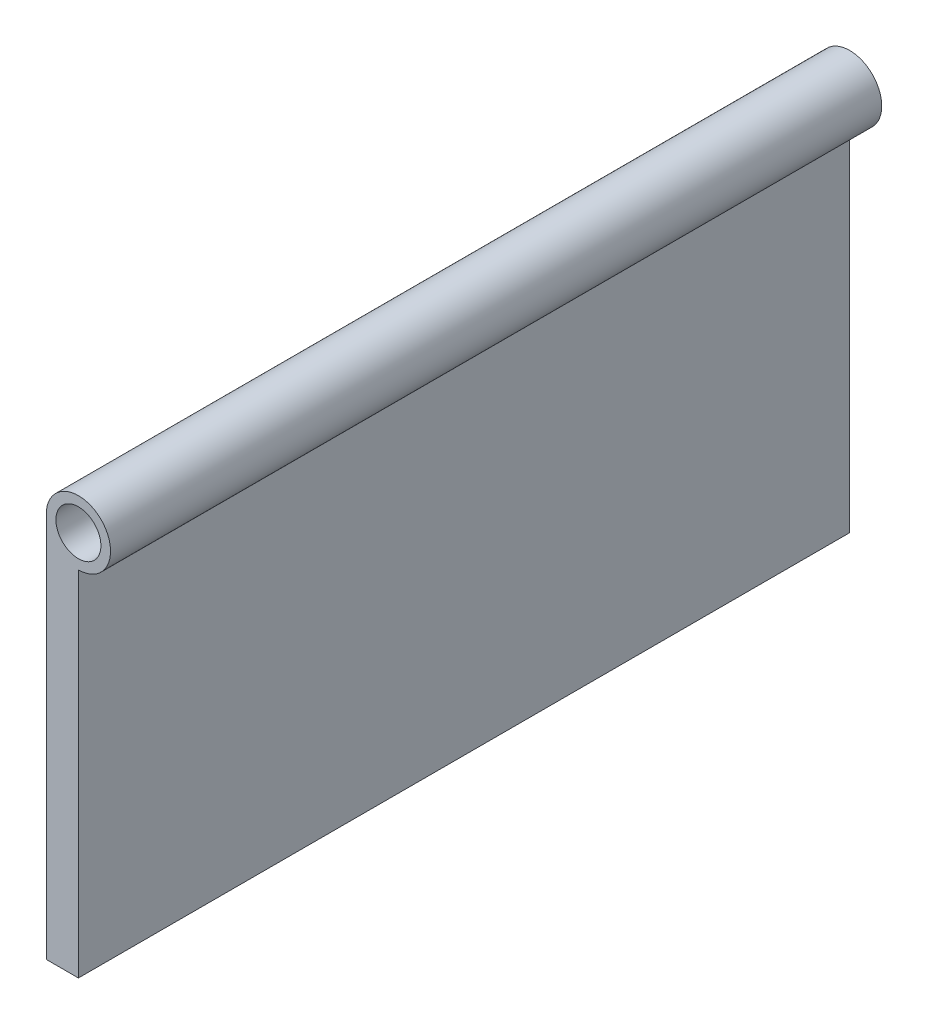
ISO-10303-21;
HEADER;
FILE_DESCRIPTION(('STEP AP214'),'2;1');
FILE_NAME('part.step','',(''),(''),'','','');
FILE_SCHEMA(('AUTOMOTIVE_DESIGN { 1 0 10303 214 1 1 1 1 }'));
ENDSEC;
DATA;
#1=APPLICATION_CONTEXT('core data for automotive mechanical design processes');
#2=APPLICATION_PROTOCOL_DEFINITION('international standard','automotive_design',2000,#1);
#3=PRODUCT_CONTEXT('',#1,'mechanical');
#4=PRODUCT('Part','Part','',(#3));
#5=PRODUCT_RELATED_PRODUCT_CATEGORY('part','',(#4));
#6=PRODUCT_DEFINITION_FORMATION('','',#4);
#7=PRODUCT_DEFINITION_CONTEXT('part definition',#1,'design');
#8=PRODUCT_DEFINITION('design','',#6,#7);
#9=PRODUCT_DEFINITION_SHAPE('','',#8);
#10=(LENGTH_UNIT() NAMED_UNIT(*) SI_UNIT(.MILLI.,.METRE.));
#11=(NAMED_UNIT(*) PLANE_ANGLE_UNIT() SI_UNIT($,.RADIAN.));
#12=(NAMED_UNIT(*) SI_UNIT($,.STERADIAN.) SOLID_ANGLE_UNIT());
#13=UNCERTAINTY_MEASURE_WITH_UNIT(LENGTH_MEASURE(1.E-05),#10,'distance_accuracy_value','');
#14=(GEOMETRIC_REPRESENTATION_CONTEXT(3) GLOBAL_UNCERTAINTY_ASSIGNED_CONTEXT((#13)) GLOBAL_UNIT_ASSIGNED_CONTEXT((#10,
#11,#12)) REPRESENTATION_CONTEXT('',''));
#15=CARTESIAN_POINT('',(0.,0.,0.));
#16=DIRECTION('',(0.,0.,1.));
#17=DIRECTION('',(1.,0.,0.));
#18=AXIS2_PLACEMENT_3D('',#15,#16,#17);
#19=CARTESIAN_POINT('',(5.,0.,60.));
#20=DIRECTION('',(-1.,0.,0.));
#21=DIRECTION('',(0.,0.,1.));
#22=AXIS2_PLACEMENT_3D('',#19,#20,#21);
#23=PLANE('',#22);
#24=DIRECTION('',(0.,1.,0.));
#25=VECTOR('',#24,1.);
#26=CARTESIAN_POINT('',(5.,0.,-60.));
#27=LINE('',#26,#25);
#28=CARTESIAN_POINT('',(5.,0.,-60.));
#29=VERTEX_POINT('',#28);
#30=CARTESIAN_POINT('',(5.,55.,-60.));
#31=VERTEX_POINT('',#30);
#32=EDGE_CURVE('E66',#29,#31,#27,.T.);
#33=ORIENTED_EDGE('',*,*,#32,.T.);
#34=DIRECTION('',(0.,0.,1.));
#35=VECTOR('',#34,1.);
#36=CARTESIAN_POINT('',(5.,55.,-60.));
#37=LINE('',#36,#35);
#38=CARTESIAN_POINT('',(5.,55.,60.));
#39=VERTEX_POINT('',#38);
#40=EDGE_CURVE('E80',#31,#39,#37,.T.);
#41=ORIENTED_EDGE('',*,*,#40,.T.);
#42=DIRECTION('',(0.,1.,0.));
#43=VECTOR('',#42,1.);
#44=CARTESIAN_POINT('',(5.,0.,60.));
#45=LINE('',#44,#43);
#46=CARTESIAN_POINT('',(5.,0.,60.));
#47=VERTEX_POINT('',#46);
#48=EDGE_CURVE('E68',#47,#39,#45,.T.);
#49=ORIENTED_EDGE('',*,*,#48,.F.);
#50=DIRECTION('',(0.,0.,-1.));
#51=VECTOR('',#50,1.);
#52=CARTESIAN_POINT('',(5.,0.,60.));
#53=LINE('',#52,#51);
#54=EDGE_CURVE('E49',#47,#29,#53,.T.);
#55=ORIENTED_EDGE('',*,*,#54,.T.);
#56=EDGE_LOOP('',(#33,#41,#49,#55));
#57=FACE_BOUND('',#56,.T.);
#58=ADVANCED_FACE('F33',(#57),#23,.F.);
#59=CARTESIAN_POINT('',(0.,0.,60.));
#60=DIRECTION('',(-1.,0.,0.));
#61=DIRECTION('',(0.,0.,1.));
#62=AXIS2_PLACEMENT_3D('',#59,#60,#61);
#63=PLANE('',#62);
#64=DIRECTION('',(0.,1.,0.));
#65=VECTOR('',#64,1.);
#66=CARTESIAN_POINT('',(0.,0.,-60.));
#67=LINE('',#66,#65);
#68=CARTESIAN_POINT('',(0.,0.,-60.));
#69=VERTEX_POINT('',#68);
#70=CARTESIAN_POINT('',(0.,60.,-60.));
#71=VERTEX_POINT('',#70);
#72=EDGE_CURVE('E79',#69,#71,#67,.T.);
#73=ORIENTED_EDGE('',*,*,#72,.F.);
#74=DIRECTION('',(0.,0.,-1.));
#75=VECTOR('',#74,1.);
#76=CARTESIAN_POINT('',(0.,0.,60.));
#77=LINE('',#76,#75);
#78=CARTESIAN_POINT('',(0.,0.,60.));
#79=VERTEX_POINT('',#78);
#80=EDGE_CURVE('E41',#79,#69,#77,.T.);
#81=ORIENTED_EDGE('',*,*,#80,.F.);
#82=DIRECTION('',(0.,1.,0.));
#83=VECTOR('',#82,1.);
#84=CARTESIAN_POINT('',(0.,0.,60.));
#85=LINE('',#84,#83);
#86=CARTESIAN_POINT('',(0.,60.,60.));
#87=VERTEX_POINT('',#86);
#88=EDGE_CURVE('E84',#79,#87,#85,.T.);
#89=ORIENTED_EDGE('',*,*,#88,.T.);
#90=DIRECTION('',(0.,0.,-1.));
#91=VECTOR('',#90,1.);
#92=CARTESIAN_POINT('',(0.,60.,60.));
#93=LINE('',#92,#91);
#94=EDGE_CURVE('E11',#87,#71,#93,.T.);
#95=ORIENTED_EDGE('',*,*,#94,.T.);
#96=EDGE_LOOP('',(#73,#81,#89,#95));
#97=FACE_BOUND('',#96,.T.);
#98=ADVANCED_FACE('F124',(#97),#63,.T.);
#99=CARTESIAN_POINT('',(5.,0.,60.));
#100=DIRECTION('',(0.,-1.,0.));
#101=DIRECTION('',(0.,0.,-1.));
#102=AXIS2_PLACEMENT_3D('',#99,#100,#101);
#103=PLANE('',#102);
#104=DIRECTION('',(-1.,0.,0.));
#105=VECTOR('',#104,1.);
#106=CARTESIAN_POINT('',(5.,0.,-60.));
#107=LINE('',#106,#105);
#108=EDGE_CURVE('E77',#29,#69,#107,.T.);
#109=ORIENTED_EDGE('',*,*,#108,.F.);
#110=ORIENTED_EDGE('',*,*,#54,.F.);
#111=DIRECTION('',(-1.,0.,0.));
#112=VECTOR('',#111,1.);
#113=CARTESIAN_POINT('',(5.,0.,60.));
#114=LINE('',#113,#112);
#115=EDGE_CURVE('E70',#47,#79,#114,.T.);
#116=ORIENTED_EDGE('',*,*,#115,.T.);
#117=ORIENTED_EDGE('',*,*,#80,.T.);
#118=EDGE_LOOP('',(#109,#110,#116,#117));
#119=FACE_BOUND('',#118,.T.);
#120=ADVANCED_FACE('F82',(#119),#103,.T.);
#121=CARTESIAN_POINT('',(0.,0.,60.));
#122=DIRECTION('',(0.,0.,-1.));
#123=DIRECTION('',(-1.,0.,0.));
#124=AXIS2_PLACEMENT_3D('',#121,#122,#123);
#125=PLANE('',#124);
#126=CARTESIAN_POINT('',(5.,60.,60.));
#127=DIRECTION('',(0.,0.,1.));
#128=DIRECTION('',(1.,0.,0.));
#129=AXIS2_PLACEMENT_3D('',#126,#127,#128);
#130=CIRCLE('',#129,3.5);
#131=CARTESIAN_POINT('',(8.5,60.,60.));
#132=VERTEX_POINT('',#131);
#133=EDGE_CURVE('E97',#132,#132,#130,.T.);
#134=ORIENTED_EDGE('',*,*,#133,.F.);
#135=EDGE_LOOP('',(#134));
#136=FACE_BOUND('',#135,.T.);
#137=ORIENTED_EDGE('',*,*,#48,.T.);
#138=CARTESIAN_POINT('',(5.,60.,60.));
#139=DIRECTION('',(0.,0.,1.));
#140=DIRECTION('',(1.,0.,0.));
#141=AXIS2_PLACEMENT_3D('',#138,#139,#140);
#142=CIRCLE('',#141,5.);
#143=EDGE_CURVE('E92',#39,#87,#142,.T.);
#144=ORIENTED_EDGE('',*,*,#143,.T.);
#145=ORIENTED_EDGE('',*,*,#88,.F.);
#146=ORIENTED_EDGE('',*,*,#115,.F.);
#147=EDGE_LOOP('',(#137,#144,#145,#146));
#148=FACE_BOUND('',#147,.T.);
#149=ADVANCED_FACE('F111',(#136,#148),#125,.F.);
#150=CARTESIAN_POINT('',(0.,0.,-60.));
#151=DIRECTION('',(0.,0.,-1.));
#152=DIRECTION('',(-1.,0.,0.));
#153=AXIS2_PLACEMENT_3D('',#150,#151,#152);
#154=PLANE('',#153);
#155=CARTESIAN_POINT('',(5.,60.,-60.));
#156=DIRECTION('',(0.,0.,1.));
#157=DIRECTION('',(1.,0.,0.));
#158=AXIS2_PLACEMENT_3D('',#155,#156,#157);
#159=CIRCLE('',#158,3.5);
#160=CARTESIAN_POINT('',(8.5,60.,-60.));
#161=VERTEX_POINT('',#160);
#162=EDGE_CURVE('E95',#161,#161,#159,.T.);
#163=ORIENTED_EDGE('',*,*,#162,.T.);
#164=EDGE_LOOP('',(#163));
#165=FACE_BOUND('',#164,.T.);
#166=ORIENTED_EDGE('',*,*,#72,.T.);
#167=CARTESIAN_POINT('',(5.,60.,-60.));
#168=DIRECTION('',(0.,0.,1.));
#169=DIRECTION('',(1.,0.,0.));
#170=AXIS2_PLACEMENT_3D('',#167,#168,#169);
#171=CIRCLE('',#170,5.);
#172=EDGE_CURVE('E78',#31,#71,#171,.T.);
#173=ORIENTED_EDGE('',*,*,#172,.F.);
#174=ORIENTED_EDGE('',*,*,#32,.F.);
#175=ORIENTED_EDGE('',*,*,#108,.T.);
#176=EDGE_LOOP('',(#166,#173,#174,#175));
#177=FACE_BOUND('',#176,.T.);
#178=ADVANCED_FACE('F76',(#165,#177),#154,.T.);
#179=CARTESIAN_POINT('',(5.,60.,-60.));
#180=DIRECTION('',(0.,0.,1.));
#181=DIRECTION('',(1.,0.,0.));
#182=AXIS2_PLACEMENT_3D('',#179,#180,#181);
#183=CYLINDRICAL_SURFACE('',#182,5.);
#184=ORIENTED_EDGE('',*,*,#40,.F.);
#185=ORIENTED_EDGE('',*,*,#172,.T.);
#186=ORIENTED_EDGE('',*,*,#94,.F.);
#187=ORIENTED_EDGE('',*,*,#143,.F.);
#188=EDGE_LOOP('',(#184,#185,#186,#187));
#189=FACE_BOUND('',#188,.T.);
#190=ADVANCED_FACE('F107',(#189),#183,.T.);
#191=CARTESIAN_POINT('',(5.,60.,-60.));
#192=DIRECTION('',(0.,0.,1.));
#193=DIRECTION('',(1.,0.,0.));
#194=AXIS2_PLACEMENT_3D('',#191,#192,#193);
#195=CYLINDRICAL_SURFACE('',#194,3.5);
#196=ORIENTED_EDGE('',*,*,#162,.F.);
#197=EDGE_LOOP('',(#196));
#198=FACE_BOUND('',#197,.T.);
#199=ORIENTED_EDGE('',*,*,#133,.T.);
#200=EDGE_LOOP('',(#199));
#201=FACE_BOUND('',#200,.T.);
#202=ADVANCED_FACE('F104',(#198,#201),#195,.F.);
#203=CLOSED_SHELL('',(#58,#98,#120,#149,#178,#190,#202));
#204=MANIFOLD_SOLID_BREP('B2',#203);
#205=ADVANCED_BREP_SHAPE_REPRESENTATION('',(#18,#204),#14);
#206=SHAPE_DEFINITION_REPRESENTATION(#9,#205);
ENDSEC;
END-ISO-10303-21;
